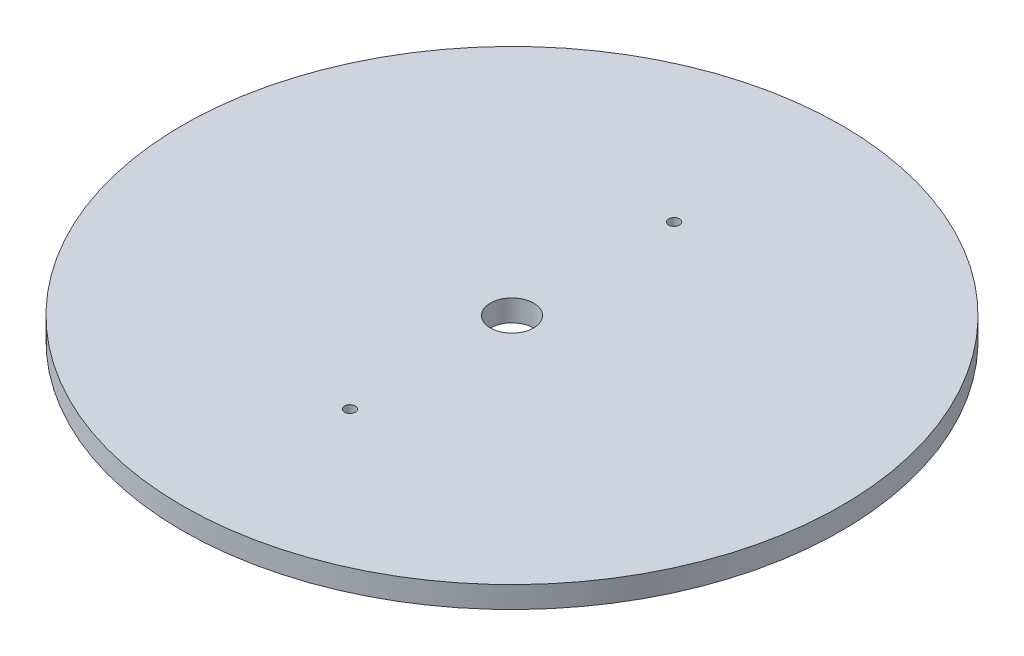
ISO-10303-21;
HEADER;
FILE_DESCRIPTION(('STEP AP214'),'2;1');
FILE_NAME('part.step','',(''),(''),'','','');
FILE_SCHEMA(('AUTOMOTIVE_DESIGN { 1 0 10303 214 1 1 1 1 }'));
ENDSEC;
DATA;
#1=APPLICATION_CONTEXT('core data for automotive mechanical design processes');
#2=APPLICATION_PROTOCOL_DEFINITION('international standard','automotive_design',2000,#1);
#3=PRODUCT_CONTEXT('',#1,'mechanical');
#4=PRODUCT('Part','Part','',(#3));
#5=PRODUCT_RELATED_PRODUCT_CATEGORY('part','',(#4));
#6=PRODUCT_DEFINITION_FORMATION('','',#4);
#7=PRODUCT_DEFINITION_CONTEXT('part definition',#1,'design');
#8=PRODUCT_DEFINITION('design','',#6,#7);
#9=PRODUCT_DEFINITION_SHAPE('','',#8);
#10=(LENGTH_UNIT() NAMED_UNIT(*) SI_UNIT(.MILLI.,.METRE.));
#11=(NAMED_UNIT(*) PLANE_ANGLE_UNIT() SI_UNIT($,.RADIAN.));
#12=(NAMED_UNIT(*) SI_UNIT($,.STERADIAN.) SOLID_ANGLE_UNIT());
#13=UNCERTAINTY_MEASURE_WITH_UNIT(LENGTH_MEASURE(1.E-05),#10,'distance_accuracy_value','');
#14=(GEOMETRIC_REPRESENTATION_CONTEXT(3) GLOBAL_UNCERTAINTY_ASSIGNED_CONTEXT((#13)) GLOBAL_UNIT_ASSIGNED_CONTEXT((#10,
#11,#12)) REPRESENTATION_CONTEXT('',''));
#15=CARTESIAN_POINT('',(0.,0.,0.));
#16=DIRECTION('',(0.,0.,1.));
#17=DIRECTION('',(1.,0.,0.));
#18=AXIS2_PLACEMENT_3D('',#15,#16,#17);
#19=CARTESIAN_POINT('',(-3.73720130614363E-10,0.,15.0000000004035));
#20=DIRECTION('',(0.,1.,0.));
#21=DIRECTION('',(0.,0.,1.));
#22=AXIS2_PLACEMENT_3D('',#19,#20,#21);
#23=CYLINDRICAL_SURFACE('',#22,0.5);
#24=CARTESIAN_POINT('',(-3.73720130614363E-10,2.,15.0000000004035));
#25=DIRECTION('',(0.,1.,0.));
#26=DIRECTION('',(0.,0.,-1.));
#27=AXIS2_PLACEMENT_3D('',#24,#25,#26);
#28=CIRCLE('',#27,0.5);
#29=CARTESIAN_POINT('',(-3.73720130614363E-10,2.,14.5000000004035));
#30=VERTEX_POINT('',#29);
#31=EDGE_CURVE('E169',#30,#30,#28,.T.);
#32=ORIENTED_EDGE('',*,*,#31,.T.);
#33=EDGE_LOOP('',(#32));
#34=FACE_BOUND('',#33,.T.);
#35=CARTESIAN_POINT('',(-3.73720130614363E-10,0.5,15.0000000004035));
#36=DIRECTION('',(0.,-1.,0.));
#37=DIRECTION('',(0.,0.,-1.));
#38=AXIS2_PLACEMENT_3D('',#35,#36,#37);
#39=CIRCLE('',#38,0.5);
#40=CARTESIAN_POINT('',(-3.73720130614363E-10,0.5,14.5000000004035));
#41=VERTEX_POINT('',#40);
#42=EDGE_CURVE('E163',#41,#41,#39,.F.);
#43=ORIENTED_EDGE('',*,*,#42,.F.);
#44=EDGE_LOOP('',(#43));
#45=FACE_BOUND('',#44,.T.);
#46=ADVANCED_FACE('F32',(#34,#45),#23,.F.);
#47=CARTESIAN_POINT('',(0.,2.,0.));
#48=DIRECTION('',(0.,-1.,0.));
#49=DIRECTION('',(0.,0.,-1.));
#50=AXIS2_PLACEMENT_3D('',#47,#48,#49);
#51=CYLINDRICAL_SURFACE('',#50,30.5);
#52=CARTESIAN_POINT('',(0.,2.,0.));
#53=DIRECTION('',(0.,1.,0.));
#54=DIRECTION('',(0.,0.,1.));
#55=AXIS2_PLACEMENT_3D('',#52,#53,#54);
#56=CIRCLE('',#55,30.5);
#57=CARTESIAN_POINT('',(0.,2.,30.5));
#58=VERTEX_POINT('',#57);
#59=EDGE_CURVE('E11',#58,#58,#56,.T.);
#60=ORIENTED_EDGE('',*,*,#59,.F.);
#61=EDGE_LOOP('',(#60));
#62=FACE_BOUND('',#61,.T.);
#63=CARTESIAN_POINT('',(0.,0.,0.));
#64=DIRECTION('',(0.,1.,0.));
#65=DIRECTION('',(0.,0.,1.));
#66=AXIS2_PLACEMENT_3D('',#63,#64,#65);
#67=CIRCLE('',#66,30.5);
#68=CARTESIAN_POINT('',(0.,0.,30.5));
#69=VERTEX_POINT('',#68);
#70=EDGE_CURVE('E41',#69,#69,#67,.T.);
#71=ORIENTED_EDGE('',*,*,#70,.T.);
#72=EDGE_LOOP('',(#71));
#73=FACE_BOUND('',#72,.T.);
#74=ADVANCED_FACE('F34',(#62,#73),#51,.T.);
#75=CARTESIAN_POINT('',(0.,2.,0.));
#76=DIRECTION('',(0.,1.,0.));
#77=DIRECTION('',(0.,0.,1.));
#78=AXIS2_PLACEMENT_3D('',#75,#76,#77);
#79=PLANE('',#78);
#80=ORIENTED_EDGE('',*,*,#31,.F.);
#81=EDGE_LOOP('',(#80));
#82=FACE_BOUND('',#81,.T.);
#83=CARTESIAN_POINT('',(-3.73720130614363E-10,2.,-15.0000000004035));
#84=DIRECTION('',(0.,1.,0.));
#85=DIRECTION('',(0.,0.,1.));
#86=AXIS2_PLACEMENT_3D('',#83,#84,#85);
#87=CIRCLE('',#86,0.5);
#88=CARTESIAN_POINT('',(-3.73720130614363E-10,2.,-14.5000000004035));
#89=VERTEX_POINT('',#88);
#90=EDGE_CURVE('E172',#89,#89,#87,.T.);
#91=ORIENTED_EDGE('',*,*,#90,.F.);
#92=EDGE_LOOP('',(#91));
#93=FACE_BOUND('',#92,.T.);
#94=CARTESIAN_POINT('',(0.,2.,0.));
#95=DIRECTION('',(0.,1.,0.));
#96=DIRECTION('',(0.,0.,1.));
#97=AXIS2_PLACEMENT_3D('',#94,#95,#96);
#98=CIRCLE('',#97,2.);
#99=CARTESIAN_POINT('',(0.,2.,2.));
#100=VERTEX_POINT('',#99);
#101=EDGE_CURVE('E175',#100,#100,#98,.T.);
#102=ORIENTED_EDGE('',*,*,#101,.F.);
#103=EDGE_LOOP('',(#102));
#104=FACE_BOUND('',#103,.T.);
#105=ORIENTED_EDGE('',*,*,#59,.T.);
#106=EDGE_LOOP('',(#105));
#107=FACE_BOUND('',#106,.T.);
#108=ADVANCED_FACE('F193',(#82,#93,#104,#107),#79,.T.);
#109=CARTESIAN_POINT('',(0.,0.,0.));
#110=DIRECTION('',(0.,1.,0.));
#111=DIRECTION('',(0.,0.,1.));
#112=AXIS2_PLACEMENT_3D('',#109,#110,#111);
#113=PLANE('',#112);
#114=DIRECTION('',(0.,0.,1.));
#115=VECTOR('',#114,1.);
#116=CARTESIAN_POINT('',(0.599999998878838,0.,-26.0000000003957));
#117=LINE('',#116,#115);
#118=CARTESIAN_POINT('',(0.599999998878838,0.,-26.0000000003957));
#119=VERTEX_POINT('',#118);
#120=CARTESIAN_POINT('',(0.599999998878836,0.,-15.0000000012026));
#121=VERTEX_POINT('',#120);
#122=EDGE_CURVE('E129',#119,#121,#117,.T.);
#123=ORIENTED_EDGE('',*,*,#122,.F.);
#124=CARTESIAN_POINT('',(-3.73720130614363E-10,0.,-26.0000000003957));
#125=DIRECTION('',(0.,-1.,0.));
#126=DIRECTION('',(0.,0.,1.));
#127=AXIS2_PLACEMENT_3D('',#124,#125,#126);
#128=CIRCLE('',#127,0.599999998878832);
#129=CARTESIAN_POINT('',(-0.599999998878826,0.,-26.0000000003957));
#130=VERTEX_POINT('',#129);
#131=EDGE_CURVE('E49',#130,#119,#128,.T.);
#132=ORIENTED_EDGE('',*,*,#131,.F.);
#133=DIRECTION('',(0.,0.,-1.));
#134=VECTOR('',#133,1.);
#135=CARTESIAN_POINT('',(-0.599999998878826,0.,-26.0000000003957));
#136=LINE('',#135,#134);
#137=CARTESIAN_POINT('',(-0.599999999252552,0.,-15.0000000012026));
#138=VERTEX_POINT('',#137);
#139=EDGE_CURVE('E120',#138,#130,#136,.T.);
#140=ORIENTED_EDGE('',*,*,#139,.F.);
#141=CARTESIAN_POINT('',(-3.73720130614363E-10,0.,-15.0000000012026));
#142=DIRECTION('',(0.,-1.,0.));
#143=DIRECTION('',(0.,0.,1.));
#144=AXIS2_PLACEMENT_3D('',#141,#142,#143);
#145=CIRCLE('',#144,0.599999998878832);
#146=EDGE_CURVE('E123',#121,#138,#145,.T.);
#147=ORIENTED_EDGE('',*,*,#146,.F.);
#148=EDGE_LOOP('',(#123,#132,#140,#147));
#149=FACE_BOUND('',#148,.T.);
#150=DIRECTION('',(0.,0.,-1.));
#151=VECTOR('',#150,1.);
#152=CARTESIAN_POINT('',(-0.599999998878826,0.,25.9999999995966));
#153=LINE('',#152,#151);
#154=CARTESIAN_POINT('',(-0.599999998878826,0.,25.9999999995966));
#155=VERTEX_POINT('',#154);
#156=CARTESIAN_POINT('',(-0.599999999252552,0.,15.0000000004035));
#157=VERTEX_POINT('',#156);
#158=EDGE_CURVE('E153',#155,#157,#153,.T.);
#159=ORIENTED_EDGE('',*,*,#158,.F.);
#160=CARTESIAN_POINT('',(-3.73720130614363E-10,0.,25.9999999995966));
#161=DIRECTION('',(0.,-1.,0.));
#162=DIRECTION('',(0.,0.,-1.));
#163=AXIS2_PLACEMENT_3D('',#160,#161,#162);
#164=CIRCLE('',#163,0.599999998878832);
#165=CARTESIAN_POINT('',(0.599999998878838,0.,25.9999999995966));
#166=VERTEX_POINT('',#165);
#167=EDGE_CURVE('E57',#166,#155,#164,.T.);
#168=ORIENTED_EDGE('',*,*,#167,.F.);
#169=DIRECTION('',(0.,0.,1.));
#170=VECTOR('',#169,1.);
#171=CARTESIAN_POINT('',(0.599999998878838,0.,25.9999999995966));
#172=LINE('',#171,#170);
#173=CARTESIAN_POINT('',(0.599999998878836,0.,15.0000000004035));
#174=VERTEX_POINT('',#173);
#175=EDGE_CURVE('E142',#174,#166,#172,.T.);
#176=ORIENTED_EDGE('',*,*,#175,.F.);
#177=CARTESIAN_POINT('',(-3.73720130614363E-10,0.,15.0000000004035));
#178=DIRECTION('',(0.,-1.,0.));
#179=DIRECTION('',(0.,0.,-1.));
#180=AXIS2_PLACEMENT_3D('',#177,#178,#179);
#181=CIRCLE('',#180,0.599999998878832);
#182=EDGE_CURVE('E156',#157,#174,#181,.T.);
#183=ORIENTED_EDGE('',*,*,#182,.F.);
#184=EDGE_LOOP('',(#159,#168,#176,#183));
#185=FACE_BOUND('',#184,.T.);
#186=CARTESIAN_POINT('',(0.,0.,0.));
#187=DIRECTION('',(0.,1.,0.));
#188=DIRECTION('',(0.,0.,1.));
#189=AXIS2_PLACEMENT_3D('',#186,#187,#188);
#190=CIRCLE('',#189,2.);
#191=CARTESIAN_POINT('',(0.,0.,2.));
#192=VERTEX_POINT('',#191);
#193=EDGE_CURVE('E176',#192,#192,#190,.T.);
#194=ORIENTED_EDGE('',*,*,#193,.T.);
#195=EDGE_LOOP('',(#194));
#196=FACE_BOUND('',#195,.T.);
#197=ORIENTED_EDGE('',*,*,#70,.F.);
#198=EDGE_LOOP('',(#197));
#199=FACE_BOUND('',#198,.T.);
#200=ADVANCED_FACE('F206',(#149,#185,#196,#199),#113,.F.);
#201=CARTESIAN_POINT('',(0.,0.,0.));
#202=DIRECTION('',(0.,1.,0.));
#203=DIRECTION('',(0.,0.,1.));
#204=AXIS2_PLACEMENT_3D('',#201,#202,#203);
#205=CYLINDRICAL_SURFACE('',#204,2.);
#206=ORIENTED_EDGE('',*,*,#193,.F.);
#207=EDGE_LOOP('',(#206));
#208=FACE_BOUND('',#207,.T.);
#209=ORIENTED_EDGE('',*,*,#101,.T.);
#210=EDGE_LOOP('',(#209));
#211=FACE_BOUND('',#210,.T.);
#212=ADVANCED_FACE('F202',(#208,#211),#205,.F.);
#213=CARTESIAN_POINT('',(-3.73720130614363E-10,0.,-15.0000000004035));
#214=DIRECTION('',(0.,1.,0.));
#215=DIRECTION('',(0.,0.,1.));
#216=AXIS2_PLACEMENT_3D('',#213,#214,#215);
#217=CYLINDRICAL_SURFACE('',#216,0.5);
#218=CARTESIAN_POINT('',(-3.73720130614363E-10,0.5,-15.0000000004035));
#219=DIRECTION('',(0.,1.,0.));
#220=DIRECTION('',(0.,0.,1.));
#221=AXIS2_PLACEMENT_3D('',#218,#219,#220);
#222=CIRCLE('',#221,0.5);
#223=CARTESIAN_POINT('',(-3.73720130614363E-10,0.5,-14.5000000004035));
#224=VERTEX_POINT('',#223);
#225=EDGE_CURVE('E36',#224,#224,#222,.F.);
#226=ORIENTED_EDGE('',*,*,#225,.T.);
#227=EDGE_LOOP('',(#226));
#228=FACE_BOUND('',#227,.T.);
#229=ORIENTED_EDGE('',*,*,#90,.T.);
#230=EDGE_LOOP('',(#229));
#231=FACE_BOUND('',#230,.T.);
#232=ADVANCED_FACE('F199',(#228,#231),#217,.F.);
#233=CARTESIAN_POINT('',(-3.73720130614363E-10,0.5,25.9999999995966));
#234=DIRECTION('',(0.,-1.,0.));
#235=DIRECTION('',(0.,0.,-1.));
#236=AXIS2_PLACEMENT_3D('',#233,#234,#235);
#237=PLANE('',#236);
#238=CARTESIAN_POINT('',(-3.73720130614363E-10,0.5,25.9999999995966));
#239=DIRECTION('',(0.,-1.,0.));
#240=DIRECTION('',(0.,0.,-1.));
#241=AXIS2_PLACEMENT_3D('',#238,#239,#240);
#242=CIRCLE('',#241,0.599999998878832);
#243=CARTESIAN_POINT('',(0.599999998878838,0.5,25.9999999995966));
#244=VERTEX_POINT('',#243);
#245=CARTESIAN_POINT('',(-0.599999998878826,0.5,25.9999999995966));
#246=VERTEX_POINT('',#245);
#247=EDGE_CURVE('E138',#244,#246,#242,.T.);
#248=ORIENTED_EDGE('',*,*,#247,.T.);
#249=DIRECTION('',(0.,0.,-1.));
#250=VECTOR('',#249,1.);
#251=CARTESIAN_POINT('',(-0.599999998878826,0.5,25.9999999995966));
#252=LINE('',#251,#250);
#253=CARTESIAN_POINT('',(-0.599999999252552,0.5,15.0000000004035));
#254=VERTEX_POINT('',#253);
#255=EDGE_CURVE('E141',#246,#254,#252,.T.);
#256=ORIENTED_EDGE('',*,*,#255,.T.);
#257=CARTESIAN_POINT('',(-3.73720130614363E-10,0.5,15.0000000004035));
#258=DIRECTION('',(0.,-1.,0.));
#259=DIRECTION('',(0.,0.,-1.));
#260=AXIS2_PLACEMENT_3D('',#257,#258,#259);
#261=CIRCLE('',#260,0.599999998878832);
#262=CARTESIAN_POINT('',(0.599999998878836,0.5,15.0000000004035));
#263=VERTEX_POINT('',#262);
#264=EDGE_CURVE('E145',#254,#263,#261,.T.);
#265=ORIENTED_EDGE('',*,*,#264,.T.);
#266=DIRECTION('',(0.,0.,1.));
#267=VECTOR('',#266,1.);
#268=CARTESIAN_POINT('',(0.599999998878838,0.5,25.9999999995966));
#269=LINE('',#268,#267);
#270=EDGE_CURVE('E148',#263,#244,#269,.T.);
#271=ORIENTED_EDGE('',*,*,#270,.T.);
#272=EDGE_LOOP('',(#248,#256,#265,#271));
#273=FACE_BOUND('',#272,.T.);
#274=ORIENTED_EDGE('',*,*,#42,.T.);
#275=EDGE_LOOP('',(#274));
#276=FACE_BOUND('',#275,.T.);
#277=ADVANCED_FACE('F185',(#273,#276),#237,.T.);
#278=CARTESIAN_POINT('',(-3.73720130614363E-10,0.5,25.9999999995966));
#279=DIRECTION('',(0.,-1.,0.));
#280=DIRECTION('',(0.,0.,-1.));
#281=AXIS2_PLACEMENT_3D('',#278,#279,#280);
#282=CYLINDRICAL_SURFACE('',#281,0.599999998878832);
#283=ORIENTED_EDGE('',*,*,#167,.T.);
#284=DIRECTION('',(0.,-1.,0.));
#285=VECTOR('',#284,1.);
#286=CARTESIAN_POINT('',(-0.599999998878826,0.5,25.9999999995966));
#287=LINE('',#286,#285);
#288=EDGE_CURVE('E151',#246,#155,#287,.T.);
#289=ORIENTED_EDGE('',*,*,#288,.F.);
#290=ORIENTED_EDGE('',*,*,#247,.F.);
#291=DIRECTION('',(0.,-1.,0.));
#292=VECTOR('',#291,1.);
#293=CARTESIAN_POINT('',(0.599999998878838,0.5,25.9999999995966));
#294=LINE('',#293,#292);
#295=EDGE_CURVE('E161',#244,#166,#294,.T.);
#296=ORIENTED_EDGE('',*,*,#295,.T.);
#297=EDGE_LOOP('',(#283,#289,#290,#296));
#298=FACE_BOUND('',#297,.T.);
#299=ADVANCED_FACE('F197',(#298),#282,.F.);
#300=CARTESIAN_POINT('',(0.599999998878838,0.5,25.9999999995966));
#301=DIRECTION('',(1.,0.,0.));
#302=DIRECTION('',(0.,0.,-1.));
#303=AXIS2_PLACEMENT_3D('',#300,#301,#302);
#304=PLANE('',#303);
#305=ORIENTED_EDGE('',*,*,#175,.T.);
#306=ORIENTED_EDGE('',*,*,#295,.F.);
#307=ORIENTED_EDGE('',*,*,#270,.F.);
#308=DIRECTION('',(0.,-1.,0.));
#309=VECTOR('',#308,1.);
#310=CARTESIAN_POINT('',(0.599999998878836,0.5,15.0000000004035));
#311=LINE('',#310,#309);
#312=EDGE_CURVE('E164',#263,#174,#311,.T.);
#313=ORIENTED_EDGE('',*,*,#312,.T.);
#314=EDGE_LOOP('',(#305,#306,#307,#313));
#315=FACE_BOUND('',#314,.T.);
#316=ADVANCED_FACE('F237',(#315),#304,.F.);
#317=CARTESIAN_POINT('',(-3.73720130614363E-10,0.5,15.0000000004035));
#318=DIRECTION('',(0.,-1.,0.));
#319=DIRECTION('',(0.,0.,-1.));
#320=AXIS2_PLACEMENT_3D('',#317,#318,#319);
#321=CYLINDRICAL_SURFACE('',#320,0.599999998878832);
#322=ORIENTED_EDGE('',*,*,#182,.T.);
#323=ORIENTED_EDGE('',*,*,#312,.F.);
#324=ORIENTED_EDGE('',*,*,#264,.F.);
#325=DIRECTION('',(0.,-1.,0.));
#326=VECTOR('',#325,1.);
#327=CARTESIAN_POINT('',(-0.599999999252552,0.5,15.0000000004035));
#328=LINE('',#327,#326);
#329=EDGE_CURVE('E166',#254,#157,#328,.T.);
#330=ORIENTED_EDGE('',*,*,#329,.T.);
#331=EDGE_LOOP('',(#322,#323,#324,#330));
#332=FACE_BOUND('',#331,.T.);
#333=ADVANCED_FACE('F239',(#332),#321,.F.);
#334=CARTESIAN_POINT('',(-0.599999998878826,0.5,25.9999999995966));
#335=DIRECTION('',(-1.,0.,0.));
#336=DIRECTION('',(0.,0.,1.));
#337=AXIS2_PLACEMENT_3D('',#334,#335,#336);
#338=PLANE('',#337);
#339=ORIENTED_EDGE('',*,*,#158,.T.);
#340=ORIENTED_EDGE('',*,*,#329,.F.);
#341=ORIENTED_EDGE('',*,*,#255,.F.);
#342=ORIENTED_EDGE('',*,*,#288,.T.);
#343=EDGE_LOOP('',(#339,#340,#341,#342));
#344=FACE_BOUND('',#343,.T.);
#345=ADVANCED_FACE('F230',(#344),#338,.F.);
#346=CARTESIAN_POINT('',(-3.73720130614363E-10,0.5,-26.0000000003957));
#347=DIRECTION('',(0.,1.,0.));
#348=DIRECTION('',(0.,0.,1.));
#349=AXIS2_PLACEMENT_3D('',#346,#347,#348);
#350=PLANE('',#349);
#351=CARTESIAN_POINT('',(-3.73720130614363E-10,0.5,-26.0000000003957));
#352=DIRECTION('',(0.,-1.,0.));
#353=DIRECTION('',(0.,0.,1.));
#354=AXIS2_PLACEMENT_3D('',#351,#352,#353);
#355=CIRCLE('',#354,0.599999998878832);
#356=CARTESIAN_POINT('',(-0.599999998878826,0.5,-26.0000000003957));
#357=VERTEX_POINT('',#356);
#358=CARTESIAN_POINT('',(0.599999998878838,0.5,-26.0000000003957));
#359=VERTEX_POINT('',#358);
#360=EDGE_CURVE('E101',#357,#359,#355,.T.);
#361=ORIENTED_EDGE('',*,*,#360,.T.);
#362=DIRECTION('',(0.,0.,1.));
#363=VECTOR('',#362,1.);
#364=CARTESIAN_POINT('',(0.599999998878838,0.5,-26.0000000003957));
#365=LINE('',#364,#363);
#366=CARTESIAN_POINT('',(0.599999998878836,0.5,-15.0000000012026));
#367=VERTEX_POINT('',#366);
#368=EDGE_CURVE('E110',#359,#367,#365,.T.);
#369=ORIENTED_EDGE('',*,*,#368,.T.);
#370=CARTESIAN_POINT('',(-3.73720130614363E-10,0.5,-15.0000000012026));
#371=DIRECTION('',(0.,-1.,0.));
#372=DIRECTION('',(0.,0.,1.));
#373=AXIS2_PLACEMENT_3D('',#370,#371,#372);
#374=CIRCLE('',#373,0.599999998878832);
#375=CARTESIAN_POINT('',(-0.599999999252552,0.5,-15.0000000012026));
#376=VERTEX_POINT('',#375);
#377=EDGE_CURVE('E115',#367,#376,#374,.T.);
#378=ORIENTED_EDGE('',*,*,#377,.T.);
#379=DIRECTION('',(0.,0.,-1.));
#380=VECTOR('',#379,1.);
#381=CARTESIAN_POINT('',(-0.599999998878826,0.5,-26.0000000003957));
#382=LINE('',#381,#380);
#383=EDGE_CURVE('E107',#376,#357,#382,.T.);
#384=ORIENTED_EDGE('',*,*,#383,.T.);
#385=EDGE_LOOP('',(#361,#369,#378,#384));
#386=FACE_BOUND('',#385,.T.);
#387=ORIENTED_EDGE('',*,*,#225,.F.);
#388=EDGE_LOOP('',(#387));
#389=FACE_BOUND('',#388,.T.);
#390=ADVANCED_FACE('F117',(#386,#389),#350,.F.);
#391=CARTESIAN_POINT('',(-3.73720130614363E-10,0.5,-26.0000000003957));
#392=DIRECTION('',(0.,-1.,0.));
#393=DIRECTION('',(0.,0.,-1.));
#394=AXIS2_PLACEMENT_3D('',#391,#392,#393);
#395=CYLINDRICAL_SURFACE('',#394,0.599999998878832);
#396=ORIENTED_EDGE('',*,*,#131,.T.);
#397=DIRECTION('',(0.,-1.,0.));
#398=VECTOR('',#397,1.);
#399=CARTESIAN_POINT('',(0.599999998878838,0.5,-26.0000000003957));
#400=LINE('',#399,#398);
#401=EDGE_CURVE('E97',#359,#119,#400,.T.);
#402=ORIENTED_EDGE('',*,*,#401,.F.);
#403=ORIENTED_EDGE('',*,*,#360,.F.);
#404=DIRECTION('',(0.,-1.,0.));
#405=VECTOR('',#404,1.);
#406=CARTESIAN_POINT('',(-0.599999998878826,0.5,-26.0000000003957));
#407=LINE('',#406,#405);
#408=EDGE_CURVE('E133',#357,#130,#407,.T.);
#409=ORIENTED_EDGE('',*,*,#408,.T.);
#410=EDGE_LOOP('',(#396,#402,#403,#409));
#411=FACE_BOUND('',#410,.T.);
#412=ADVANCED_FACE('F99',(#411),#395,.F.);
#413=CARTESIAN_POINT('',(-0.599999998878826,0.5,-26.0000000003957));
#414=DIRECTION('',(-1.,0.,0.));
#415=DIRECTION('',(0.,0.,1.));
#416=AXIS2_PLACEMENT_3D('',#413,#414,#415);
#417=PLANE('',#416);
#418=ORIENTED_EDGE('',*,*,#139,.T.);
#419=ORIENTED_EDGE('',*,*,#408,.F.);
#420=ORIENTED_EDGE('',*,*,#383,.F.);
#421=DIRECTION('',(0.,-1.,0.));
#422=VECTOR('',#421,1.);
#423=CARTESIAN_POINT('',(-0.599999999252552,0.5,-15.0000000012026));
#424=LINE('',#423,#422);
#425=EDGE_CURVE('E135',#376,#138,#424,.T.);
#426=ORIENTED_EDGE('',*,*,#425,.T.);
#427=EDGE_LOOP('',(#418,#419,#420,#426));
#428=FACE_BOUND('',#427,.T.);
#429=ADVANCED_FACE('F252',(#428),#417,.F.);
#430=CARTESIAN_POINT('',(-3.73720130614363E-10,0.5,-15.0000000012026));
#431=DIRECTION('',(0.,-1.,0.));
#432=DIRECTION('',(0.,0.,-1.));
#433=AXIS2_PLACEMENT_3D('',#430,#431,#432);
#434=CYLINDRICAL_SURFACE('',#433,0.599999998878832);
#435=ORIENTED_EDGE('',*,*,#146,.T.);
#436=ORIENTED_EDGE('',*,*,#425,.F.);
#437=ORIENTED_EDGE('',*,*,#377,.F.);
#438=DIRECTION('',(0.,-1.,0.));
#439=VECTOR('',#438,1.);
#440=CARTESIAN_POINT('',(0.599999998878836,0.5,-15.0000000012026));
#441=LINE('',#440,#439);
#442=EDGE_CURVE('E106',#367,#121,#441,.T.);
#443=ORIENTED_EDGE('',*,*,#442,.T.);
#444=EDGE_LOOP('',(#435,#436,#437,#443));
#445=FACE_BOUND('',#444,.T.);
#446=ADVANCED_FACE('F255',(#445),#434,.F.);
#447=CARTESIAN_POINT('',(0.599999998878838,0.5,-26.0000000003957));
#448=DIRECTION('',(1.,0.,0.));
#449=DIRECTION('',(0.,0.,-1.));
#450=AXIS2_PLACEMENT_3D('',#447,#448,#449);
#451=PLANE('',#450);
#452=ORIENTED_EDGE('',*,*,#122,.T.);
#453=ORIENTED_EDGE('',*,*,#442,.F.);
#454=ORIENTED_EDGE('',*,*,#368,.F.);
#455=ORIENTED_EDGE('',*,*,#401,.T.);
#456=EDGE_LOOP('',(#452,#453,#454,#455));
#457=FACE_BOUND('',#456,.T.);
#458=ADVANCED_FACE('F111',(#457),#451,.F.);
#459=CLOSED_SHELL('',(#46,#74,#108,#200,#212,#232,#277,#299,#316,#333,#345,#390,#412,#429,#446,#458));
#460=MANIFOLD_SOLID_BREP('B2',#459);
#461=ADVANCED_BREP_SHAPE_REPRESENTATION('',(#18,#460),#14);
#462=SHAPE_DEFINITION_REPRESENTATION(#9,#461);
ENDSEC;
END-ISO-10303-21;
